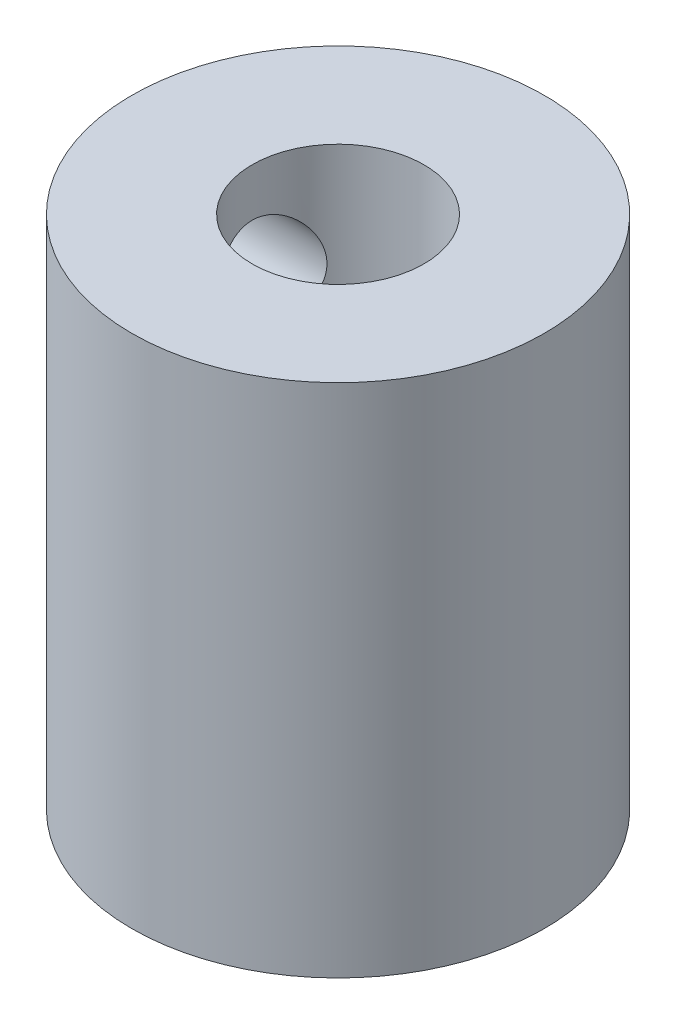
ISO-10303-21;
HEADER;
FILE_DESCRIPTION(('STEP AP214'),'2;1');
FILE_NAME('part.step','',(''),(''),'','','');
FILE_SCHEMA(('AUTOMOTIVE_DESIGN { 1 0 10303 214 1 1 1 1 }'));
ENDSEC;
DATA;
#1=APPLICATION_CONTEXT('core data for automotive mechanical design processes');
#2=APPLICATION_PROTOCOL_DEFINITION('international standard','automotive_design',2000,#1);
#3=PRODUCT_CONTEXT('',#1,'mechanical');
#4=PRODUCT('Part','Part','',(#3));
#5=PRODUCT_RELATED_PRODUCT_CATEGORY('part','',(#4));
#6=PRODUCT_DEFINITION_FORMATION('','',#4);
#7=PRODUCT_DEFINITION_CONTEXT('part definition',#1,'design');
#8=PRODUCT_DEFINITION('design','',#6,#7);
#9=PRODUCT_DEFINITION_SHAPE('','',#8);
#10=(LENGTH_UNIT() NAMED_UNIT(*) SI_UNIT(.MILLI.,.METRE.));
#11=(NAMED_UNIT(*) PLANE_ANGLE_UNIT() SI_UNIT($,.RADIAN.));
#12=(NAMED_UNIT(*) SI_UNIT($,.STERADIAN.) SOLID_ANGLE_UNIT());
#13=UNCERTAINTY_MEASURE_WITH_UNIT(LENGTH_MEASURE(1.E-05),#10,'distance_accuracy_value','');
#14=(GEOMETRIC_REPRESENTATION_CONTEXT(3) GLOBAL_UNCERTAINTY_ASSIGNED_CONTEXT((#13)) GLOBAL_UNIT_ASSIGNED_CONTEXT((#10,
#11,#12)) REPRESENTATION_CONTEXT('',''));
#15=CARTESIAN_POINT('',(0.,0.,0.));
#16=DIRECTION('',(0.,0.,1.));
#17=DIRECTION('',(1.,0.,0.));
#18=AXIS2_PLACEMENT_3D('',#15,#16,#17);
#19=CARTESIAN_POINT('',(0.,19.05,0.));
#20=DIRECTION('',(0.,1.,0.));
#21=DIRECTION('',(0.,0.,1.));
#22=AXIS2_PLACEMENT_3D('',#19,#20,#21);
#23=PLANE('',#22);
#24=CARTESIAN_POINT('',(0.,19.05,0.));
#25=DIRECTION('',(0.,1.,0.));
#26=DIRECTION('',(0.,0.,1.));
#27=AXIS2_PLACEMENT_3D('',#24,#25,#26);
#28=CIRCLE('',#27,7.62);
#29=CARTESIAN_POINT('',(0.,19.05,7.62));
#30=VERTEX_POINT('',#29);
#31=EDGE_CURVE('E10',#30,#30,#28,.T.);
#32=ORIENTED_EDGE('',*,*,#31,.T.);
#33=EDGE_LOOP('',(#32));
#34=FACE_BOUND('',#33,.T.);
#35=CARTESIAN_POINT('',(0.,19.05,0.));
#36=DIRECTION('',(0.,1.,0.));
#37=DIRECTION('',(0.,0.,1.));
#38=AXIS2_PLACEMENT_3D('',#35,#36,#37);
#39=CIRCLE('',#38,3.175);
#40=CARTESIAN_POINT('',(0.,19.05,3.175));
#41=VERTEX_POINT('',#40);
#42=EDGE_CURVE('E48',#41,#41,#39,.T.);
#43=ORIENTED_EDGE('',*,*,#42,.F.);
#44=EDGE_LOOP('',(#43));
#45=FACE_BOUND('',#44,.T.);
#46=ADVANCED_FACE('F30',(#34,#45),#23,.T.);
#47=CARTESIAN_POINT('',(0.,0.,0.));
#48=DIRECTION('',(0.,1.,0.));
#49=DIRECTION('',(0.,0.,1.));
#50=AXIS2_PLACEMENT_3D('',#47,#48,#49);
#51=PLANE('',#50);
#52=CARTESIAN_POINT('',(0.,0.,0.));
#53=DIRECTION('',(0.,1.,0.));
#54=DIRECTION('',(0.,0.,1.));
#55=AXIS2_PLACEMENT_3D('',#52,#53,#54);
#56=CIRCLE('',#55,7.62);
#57=CARTESIAN_POINT('',(0.,0.,7.62));
#58=VERTEX_POINT('',#57);
#59=EDGE_CURVE('E43',#58,#58,#56,.T.);
#60=ORIENTED_EDGE('',*,*,#59,.F.);
#61=EDGE_LOOP('',(#60));
#62=FACE_BOUND('',#61,.T.);
#63=CARTESIAN_POINT('',(0.,0.,0.));
#64=DIRECTION('',(0.,1.,0.));
#65=DIRECTION('',(0.,0.,1.));
#66=AXIS2_PLACEMENT_3D('',#63,#64,#65);
#67=CIRCLE('',#66,3.175);
#68=CARTESIAN_POINT('',(0.,0.,3.175));
#69=VERTEX_POINT('',#68);
#70=EDGE_CURVE('E51',#69,#69,#67,.T.);
#71=ORIENTED_EDGE('',*,*,#70,.T.);
#72=EDGE_LOOP('',(#71));
#73=FACE_BOUND('',#72,.T.);
#74=ADVANCED_FACE('F83',(#62,#73),#51,.F.);
#75=CARTESIAN_POINT('',(0.,19.05,0.));
#76=DIRECTION('',(0.,-1.,0.));
#77=DIRECTION('',(0.,0.,-1.));
#78=AXIS2_PLACEMENT_3D('',#75,#76,#77);
#79=CYLINDRICAL_SURFACE('',#78,7.62);
#80=CARTESIAN_POINT('',(-7.62,13.208,0.));
#81=CARTESIAN_POINT('',(-7.61999831151124,13.2080026588058,-0.11201862872618));
#82=CARTESIAN_POINT('',(-7.61750557940745,13.2172939760167,-0.22406575478539));
#83=CARTESIAN_POINT('',(-7.60780366799606,13.2541479704305,-0.444932258576134));
#84=CARTESIAN_POINT('',(-7.60059221897908,13.2817194404969,-0.553750056652191));
#85=CARTESIAN_POINT('',(-7.58224882584835,13.3541736135339,-0.764937854470037));
#86=CARTESIAN_POINT('',(-7.57112193804461,13.3990339970687,-0.867315970231529));
#87=CARTESIAN_POINT('',(-7.54612358338104,13.5047098385493,-1.06309534537494));
#88=CARTESIAN_POINT('',(-7.53225193363903,13.565526359733,-1.15649600597682));
#89=CARTESIAN_POINT('',(-7.50290208740426,13.702876852676,-1.33383477579986));
#90=CARTESIAN_POINT('',(-7.4873964316154,13.7797120066964,-1.41753507690059));
#91=CARTESIAN_POINT('',(-7.45670248234465,13.9462748587924,-1.57102773079208));
#92=CARTESIAN_POINT('',(-7.44151422994399,14.0360042140594,-1.64081829311595));
#93=CARTESIAN_POINT('',(-7.41289386063802,14.2277066065827,-1.7656699179131));
#94=CARTESIAN_POINT('',(-7.3994963878025,14.3298634695139,-1.82045739780271));
#95=CARTESIAN_POINT('',(-7.37637820955278,14.5423535528699,-1.91198548846226));
#96=CARTESIAN_POINT('',(-7.36665682625317,14.6526852613287,-1.94872942690591));
#97=CARTESIAN_POINT('',(-7.35227501655238,14.8757594664302,-2.00230150950128));
#98=CARTESIAN_POINT('',(-7.34750522176474,14.9883911965696,-2.01956080968607));
#99=CARTESIAN_POINT('',(-7.34323988211032,15.2150446862394,-2.03501787261113));
#100=CARTESIAN_POINT('',(-7.34374335174677,15.3290661820645,-2.03321919701046));
#101=CARTESIAN_POINT('',(-7.34986976862863,15.55189718202,-2.01095366162742));
#102=CARTESIAN_POINT('',(-7.35534963279716,15.6607633769511,-1.99100852561801));
#103=CARTESIAN_POINT('',(-7.37058229289979,15.8735454278075,-1.93385184701738));
#104=CARTESIAN_POINT('',(-7.38033543033454,15.9774608873566,-1.89663892444883));
#105=CARTESIAN_POINT('',(-7.4031415233636,16.1787516341095,-1.805577866767));
#106=CARTESIAN_POINT('',(-7.41623045903802,16.2760399287148,-1.75154682595989));
#107=CARTESIAN_POINT('',(-7.44421401316724,16.4603523053931,-1.62851087884958));
#108=CARTESIAN_POINT('',(-7.45910898680869,16.547374361783,-1.55950302499839));
#109=CARTESIAN_POINT('',(-7.48962190799941,16.7116648214141,-1.40580472979633));
#110=CARTESIAN_POINT('',(-7.50524759032652,16.788522499408,-1.32067617731952));
#111=CARTESIAN_POINT('',(-7.53502563376737,16.9269550008359,-1.13854755089767));
#112=CARTESIAN_POINT('',(-7.54917793680371,16.9885292219617,-1.04154700931237));
#113=CARTESIAN_POINT('',(-7.57450169524666,17.0948277892698,-0.837791827585411));
#114=CARTESIAN_POINT('',(-7.58565993998897,17.1394778067758,-0.730996660992618));
#115=CARTESIAN_POINT('',(-7.60364285111415,17.2100719438344,-0.511050331100642));
#116=CARTESIAN_POINT('',(-7.61046846441489,17.2360201509275,-0.397900562519177));
#117=CARTESIAN_POINT('',(-7.61887385095318,17.2678291949485,-0.171962148475844));
#118=CARTESIAN_POINT('',(-7.62059941430494,17.2742484484885,-0.0592574254436431));
#119=CARTESIAN_POINT('',(-7.61902943238762,17.2683595051251,0.165618206635617));
#120=CARTESIAN_POINT('',(-7.61573440609638,17.2560532438765,0.277789169655107));
#121=CARTESIAN_POINT('',(-7.60458764063957,17.2135206173807,0.496420089100207));
#122=CARTESIAN_POINT('',(-7.59681514971071,17.1836057178631,0.602945049660226));
#123=CARTESIAN_POINT('',(-7.57759515612445,17.1070666803799,0.809454282714881));
#124=CARTESIAN_POINT('',(-7.566147255241,17.0604407317294,0.909437845043482));
#125=CARTESIAN_POINT('',(-7.54050471128481,16.9507673306246,1.10219589026264));
#126=CARTESIAN_POINT('',(-7.52626065590636,16.8874160937335,1.19479079147656));
#127=CARTESIAN_POINT('',(-7.49667235603412,16.7464723437595,1.3682315895635));
#128=CARTESIAN_POINT('',(-7.4813278945916,16.6688770176773,1.44907516005997));
#129=CARTESIAN_POINT('',(-7.45073181800572,16.4990418532655,1.59907147270434));
#130=CARTESIAN_POINT('',(-7.43549502412181,16.4064507416225,1.66783023557813));
#131=CARTESIAN_POINT('',(-7.40731510337651,16.2107222687628,1.7888426624408));
#132=CARTESIAN_POINT('',(-7.39437188083617,16.1075853477597,1.84109701500115));
#133=CARTESIAN_POINT('',(-7.37239336667181,15.8942071680107,1.9272241017149));
#134=CARTESIAN_POINT('',(-7.36333552291097,15.7840112951933,1.96120321250021));
#135=CARTESIAN_POINT('',(-7.35014862328829,15.5591872512105,2.01006664400691));
#136=CARTESIAN_POINT('',(-7.34601830788334,15.4445602204465,2.02495584444118));
#137=CARTESIAN_POINT('',(-7.34325932486766,15.2181612955101,2.03493613488173));
#138=CARTESIAN_POINT('',(-7.34445468107131,15.1064190426176,2.03066046107998));
#139=CARTESIAN_POINT('',(-7.35180034418385,14.8853108297658,2.00390126016446));
#140=CARTESIAN_POINT('',(-7.3579505235863,14.7759448087314,1.98141820159586));
#141=CARTESIAN_POINT('',(-7.37440812210329,14.5634905558361,1.91924955950895));
#142=CARTESIAN_POINT('',(-7.38468307179958,14.4603603677841,1.87969815652789));
#143=CARTESIAN_POINT('',(-7.40823327226356,14.2621215081773,1.78461979435384));
#144=CARTESIAN_POINT('',(-7.42150899359306,14.1670140979187,1.7290903292101));
#145=CARTESIAN_POINT('',(-7.45005288183508,13.9844979547514,1.60171291817118));
#146=CARTESIAN_POINT('',(-7.46536818431318,13.8973981284642,1.52943285444196));
#147=CARTESIAN_POINT('',(-7.49600231843536,13.736358149106,1.37142782367277));
#148=CARTESIAN_POINT('',(-7.51132115003216,13.6624212007125,1.28569959202849));
#149=CARTESIAN_POINT('',(-7.54062817402432,13.5282510865508,1.1010188607861));
#150=CARTESIAN_POINT('',(-7.55458089095583,13.4683449091803,1.00182269713981));
#151=CARTESIAN_POINT('',(-7.57919551064544,13.3661531854158,0.794398858663558));
#152=CARTESIAN_POINT('',(-7.58985952366532,13.3238563335258,0.686177032211436));
#153=CARTESIAN_POINT('',(-7.60531628553683,13.2636003100178,0.481964700159086));
#154=CARTESIAN_POINT('',(-7.61078254922083,13.24279862627,0.386854208830076));
#155=CARTESIAN_POINT('',(-7.61812496221039,13.2149979985343,0.19450283204215));
#156=CARTESIAN_POINT('',(-7.62000146606026,13.2079976914448,0.0972621579313382));
#157=CARTESIAN_POINT('',(-7.62,13.208,0.));
#158=B_SPLINE_CURVE_WITH_KNOTS('',3,(#80,#81,#82,#83,#84,#85,#86,#87,#88,#89,#90,#91,#92,#93,
#94,#95,#96,#97,#98,#99,#100,#101,#102,#103,#104,#105,#106,#107,#108,#109,#110,#111,#112,#113,
#114,#115,#116,#117,#118,#119,#120,#121,#122,#123,#124,#125,#126,#127,#128,#129,#130,#131,#132,
#133,#134,#135,#136,#137,#138,#139,#140,#141,#142,#143,#144,#145,#146,#147,#148,#149,#150,#151,
#152,#153,#154,#155,#156,#157),.UNSPECIFIED.,.T.,.F.,(4,2,2,2,2,2,2,2,2,2,2,2,2,2,2,2,2,2,2,2,2,
2,2,2,2,2,2,2,2,2,2,2,2,2,2,2,2,2,4),(0.,0.335699200532762,0.671559991661632,1.00698864181948,
1.34243964896014,1.68488256322246,2.02736952843951,2.37573903843601,2.72404427635775,
3.06448112782475,3.40485435770789,3.73574058078732,4.06665325161947,4.40129852120042,
4.73600971127512,5.08163839969319,5.42728070688599,5.7744239055669,6.12149120825181,
6.45853641004939,6.79554677388156,7.12676792212389,7.45802496988024,7.79577090580623,
8.13358361351029,8.48092280324913,8.82824749992493,9.17352798462576,9.51872019202606,
9.85259235882069,10.1864559340892,10.5177413769548,10.8490788059697,11.1901664900453,
11.5313371032177,11.8798060831739,12.228050993635,12.5195565609723,12.8110333361384),.UNSPECIFIED.);
#159=CARTESIAN_POINT('',(-7.62,13.208,0.));
#160=VERTEX_POINT('',#159);
#161=EDGE_CURVE('E59',#160,#160,#158,.T.);
#162=ORIENTED_EDGE('',*,*,#161,.T.);
#163=EDGE_LOOP('',(#162));
#164=FACE_BOUND('',#163,.T.);
#165=CARTESIAN_POINT('',(-7.62,1.778,0.));
#166=CARTESIAN_POINT('',(-7.61999831151124,1.77800265880581,-0.11201862872618));
#167=CARTESIAN_POINT('',(-7.61750557940745,1.78729397601671,-0.22406575478539));
#168=CARTESIAN_POINT('',(-7.60780366799606,1.82414797043051,-0.444932258576135));
#169=CARTESIAN_POINT('',(-7.60059221897908,1.85171944049693,-0.553750056652192));
#170=CARTESIAN_POINT('',(-7.58224882584835,1.92417361353386,-0.764937854470037));
#171=CARTESIAN_POINT('',(-7.57112193804461,1.96903399706868,-0.867315970231529));
#172=CARTESIAN_POINT('',(-7.54612358338104,2.07470983854928,-1.06309534537494));
#173=CARTESIAN_POINT('',(-7.53225193363903,2.13552635973304,-1.15649600597682));
#174=CARTESIAN_POINT('',(-7.50290208740426,2.27287685267598,-1.33383477579986));
#175=CARTESIAN_POINT('',(-7.4873964316154,2.3497120066964,-1.41753507690059));
#176=CARTESIAN_POINT('',(-7.45670248234465,2.51627485879237,-1.57102773079208));
#177=CARTESIAN_POINT('',(-7.44151422994399,2.60600421405941,-1.64081829311595));
#178=CARTESIAN_POINT('',(-7.41289386063802,2.79770660658266,-1.7656699179131));
#179=CARTESIAN_POINT('',(-7.3994963878025,2.89986346951392,-1.82045739780271));
#180=CARTESIAN_POINT('',(-7.37637820955278,3.1123535528699,-1.91198548846226));
#181=CARTESIAN_POINT('',(-7.36665682625317,3.22268526132874,-1.94872942690591));
#182=CARTESIAN_POINT('',(-7.35227501655238,3.44575946643021,-2.00230150950128));
#183=CARTESIAN_POINT('',(-7.34750522176474,3.55839119656963,-2.01956080968607));
#184=CARTESIAN_POINT('',(-7.34323988211032,3.78504468623944,-2.03501787261113));
#185=CARTESIAN_POINT('',(-7.34374335174676,3.89906618206445,-2.03321919701046));
#186=CARTESIAN_POINT('',(-7.34986976862863,4.12189718202005,-2.01095366162742));
#187=CARTESIAN_POINT('',(-7.35534963279716,4.2307633769511,-1.99100852561801));
#188=CARTESIAN_POINT('',(-7.37058229289979,4.44354542780754,-1.93385184701738));
#189=CARTESIAN_POINT('',(-7.38033543033454,4.54746088735655,-1.89663892444883));
#190=CARTESIAN_POINT('',(-7.4031415233636,4.74875163410951,-1.805577866767));
#191=CARTESIAN_POINT('',(-7.41623045903802,4.84603992871484,-1.75154682595989));
#192=CARTESIAN_POINT('',(-7.44421401316724,5.03035230539315,-1.62851087884958));
#193=CARTESIAN_POINT('',(-7.45910898680869,5.11737436178297,-1.55950302499839));
#194=CARTESIAN_POINT('',(-7.48962190799941,5.28166482141408,-1.40580472979634));
#195=CARTESIAN_POINT('',(-7.50524759032652,5.35852249940799,-1.32067617731952));
#196=CARTESIAN_POINT('',(-7.53502563376737,5.49695500083589,-1.13854755089767));
#197=CARTESIAN_POINT('',(-7.54917793680371,5.55852922196167,-1.04154700931237));
#198=CARTESIAN_POINT('',(-7.57450169524666,5.66482778926984,-0.83779182758541));
#199=CARTESIAN_POINT('',(-7.58565993998897,5.70947780677577,-0.730996660992618));
#200=CARTESIAN_POINT('',(-7.60364285111415,5.78007194383439,-0.511050331100642));
#201=CARTESIAN_POINT('',(-7.61046846441489,5.80602015092754,-0.397900562519176));
#202=CARTESIAN_POINT('',(-7.61887385095318,5.83782919494851,-0.171962148475843));
#203=CARTESIAN_POINT('',(-7.62059941430494,5.84424844848848,-0.0592574254436418));
#204=CARTESIAN_POINT('',(-7.61902943238762,5.8383595051251,0.165618206635619));
#205=CARTESIAN_POINT('',(-7.61573440609638,5.82605324387654,0.277789169655108));
#206=CARTESIAN_POINT('',(-7.60458764063957,5.78352061738066,0.496420089100209));
#207=CARTESIAN_POINT('',(-7.59681514971071,5.75360571786307,0.602945049660228));
#208=CARTESIAN_POINT('',(-7.57759515612445,5.67706668037992,0.809454282714883));
#209=CARTESIAN_POINT('',(-7.566147255241,5.63044073172945,0.909437845043484));
#210=CARTESIAN_POINT('',(-7.54050471128481,5.52076733062458,1.10219589026264));
#211=CARTESIAN_POINT('',(-7.52626065590636,5.45741609373349,1.19479079147656));
#212=CARTESIAN_POINT('',(-7.49667235603412,5.31647234375948,1.3682315895635));
#213=CARTESIAN_POINT('',(-7.4813278945916,5.23887701767733,1.44907516005997));
#214=CARTESIAN_POINT('',(-7.45073181800572,5.06904185326553,1.59907147270434));
#215=CARTESIAN_POINT('',(-7.43549502412181,4.9764507416225,1.66783023557813));
#216=CARTESIAN_POINT('',(-7.40731510337651,4.78072226876278,1.7888426624408));
#217=CARTESIAN_POINT('',(-7.39437188083617,4.67758534775974,1.84109701500115));
#218=CARTESIAN_POINT('',(-7.37239336667181,4.46420716801068,1.9272241017149));
#219=CARTESIAN_POINT('',(-7.36333552291097,4.35401129519334,1.96120321250021));
#220=CARTESIAN_POINT('',(-7.35014862328829,4.12918725121045,2.01006664400691));
#221=CARTESIAN_POINT('',(-7.34601830788334,4.01456022044652,2.02495584444118));
#222=CARTESIAN_POINT('',(-7.34325932486766,3.78816129551006,2.03493613488173));
#223=CARTESIAN_POINT('',(-7.34445468107131,3.67641904261758,2.03066046107998));
#224=CARTESIAN_POINT('',(-7.35180034418385,3.45531082976581,2.00390126016446));
#225=CARTESIAN_POINT('',(-7.3579505235863,3.34594480873141,1.98141820159586));
#226=CARTESIAN_POINT('',(-7.37440812210329,3.13349055583608,1.91924955950894));
#227=CARTESIAN_POINT('',(-7.38468307179958,3.0303603677841,1.87969815652789));
#228=CARTESIAN_POINT('',(-7.40823327226356,2.83212150817731,1.78461979435384));
#229=CARTESIAN_POINT('',(-7.42150899359306,2.7370140979187,1.7290903292101));
#230=CARTESIAN_POINT('',(-7.45005288183508,2.55449795475144,1.60171291817118));
#231=CARTESIAN_POINT('',(-7.46536818431318,2.46739812846417,1.52943285444196));
#232=CARTESIAN_POINT('',(-7.49600231843536,2.306358149106,1.37142782367278));
#233=CARTESIAN_POINT('',(-7.51132115003216,2.23242120071245,1.28569959202849));
#234=CARTESIAN_POINT('',(-7.54062817402432,2.09825108655079,1.1010188607861));
#235=CARTESIAN_POINT('',(-7.55458089095583,2.03834490918028,1.00182269713981));
#236=CARTESIAN_POINT('',(-7.57919551064544,1.93615318541577,0.794398858663559));
#237=CARTESIAN_POINT('',(-7.58985952366532,1.89385633352578,0.686177032211437));
#238=CARTESIAN_POINT('',(-7.60531628553683,1.83360031001784,0.481964700159086));
#239=CARTESIAN_POINT('',(-7.61078254922083,1.81279862627002,0.386854208830076));
#240=CARTESIAN_POINT('',(-7.61812496221039,1.78499799853427,0.19450283204215));
#241=CARTESIAN_POINT('',(-7.62000146606026,1.77799769144478,0.0972621579313383));
#242=CARTESIAN_POINT('',(-7.62,1.778,0.));
#243=B_SPLINE_CURVE_WITH_KNOTS('',3,(#165,#166,#167,#168,#169,#170,#171,#172,#173,#174,#175,
#176,#177,#178,#179,#180,#181,#182,#183,#184,#185,#186,#187,#188,#189,#190,#191,#192,#193,#194,
#195,#196,#197,#198,#199,#200,#201,#202,#203,#204,#205,#206,#207,#208,#209,#210,#211,#212,#213,
#214,#215,#216,#217,#218,#219,#220,#221,#222,#223,#224,#225,#226,#227,#228,#229,#230,#231,#232,
#233,#234,#235,#236,#237,#238,#239,#240,#241,#242),.UNSPECIFIED.,.T.,.F.,(4,2,2,2,2,2,2,2,2,2,2,
2,2,2,2,2,2,2,2,2,2,2,2,2,2,2,2,2,2,2,2,2,2,2,2,2,2,2,4),(0.,0.335699200532762,
0.671559991661633,1.00698864181948,1.34243964896014,1.68488256322246,2.02736952843951,
2.37573903843601,2.72404427635775,3.06448112782475,3.40485435770789,3.73574058078733,
4.06665325161947,4.40129852120042,4.73600971127512,5.08163839969319,5.42728070688599,
5.7744239055669,6.12149120825181,6.4585364100494,6.79554677388156,7.1267679221239,
7.45802496988024,7.79577090580623,8.13358361351029,8.48092280324913,8.82824749992493,
9.17352798462577,9.51872019202607,9.85259235882069,10.1864559340892,10.5177413769548,
10.8490788059697,11.1901664900453,11.5313371032177,11.8798060831739,12.228050993635,
12.5195565609723,12.8110333361384),.UNSPECIFIED.);
#244=CARTESIAN_POINT('',(-7.62,1.778,0.));
#245=VERTEX_POINT('',#244);
#246=EDGE_CURVE('E58',#245,#245,#243,.T.);
#247=ORIENTED_EDGE('',*,*,#246,.T.);
#248=EDGE_LOOP('',(#247));
#249=FACE_BOUND('',#248,.T.);
#250=ORIENTED_EDGE('',*,*,#31,.F.);
#251=EDGE_LOOP('',(#250));
#252=FACE_BOUND('',#251,.T.);
#253=ORIENTED_EDGE('',*,*,#59,.T.);
#254=EDGE_LOOP('',(#253));
#255=FACE_BOUND('',#254,.T.);
#256=ADVANCED_FACE('F32',(#164,#249,#252,#255),#79,.T.);
#257=CARTESIAN_POINT('',(0.,19.05,0.));
#258=DIRECTION('',(0.,-1.,0.));
#259=DIRECTION('',(0.,0.,-1.));
#260=AXIS2_PLACEMENT_3D('',#257,#258,#259);
#261=CYLINDRICAL_SURFACE('',#260,3.175);
#262=CARTESIAN_POINT('',(-2.43959033446192,15.24,-2.032));
#263=CARTESIAN_POINT('',(-2.43960560687535,15.340395826837,-2.0319906906494));
#264=CARTESIAN_POINT('',(-2.44590181613486,15.4408746622441,-2.02449520417272));
#265=CARTESIAN_POINT('',(-2.46993660816849,15.6383445956715,-1.99508592642367));
#266=CARTESIAN_POINT('',(-2.48769727853939,15.7353285788289,-1.97314430137826));
#267=CARTESIAN_POINT('',(-2.53160890569595,15.9223941244383,-1.91646567701481));
#268=CARTESIAN_POINT('',(-2.55768544747968,16.0125284423073,-1.8818417721297));
#269=CARTESIAN_POINT('',(-2.61516202663432,16.185594660608,-1.80111207066332));
#270=CARTESIAN_POINT('',(-2.64656318171096,16.2685250433011,-1.7550038624223));
#271=CARTESIAN_POINT('',(-2.71649639761512,16.4377071038508,-1.64502031014287));
#272=CARTESIAN_POINT('',(-2.75540869613421,16.5227675615019,-1.57955393544279));
#273=CARTESIAN_POINT('',(-2.83290166546679,16.6817156321777,-1.43595387251811));
#274=CARTESIAN_POINT('',(-2.8714820155507,16.7555933822286,-1.35780912655708));
#275=CARTESIAN_POINT('',(-2.94983597723037,16.8995275455208,-1.17890004918128));
#276=CARTESIAN_POINT('',(-2.98912307518315,16.96786571149,-1.07651864172312));
#277=CARTESIAN_POINT('',(-3.05879981218692,17.0857832996314,-0.858714894448379));
#278=CARTESIAN_POINT('',(-3.08919860887737,17.1353820445857,-0.743306147922976));
#279=CARTESIAN_POINT('',(-3.13478263885192,17.2087543256668,-0.515551988416906));
#280=CARTESIAN_POINT('',(-3.15123393511991,17.2346992896143,-0.404166418731377));
#281=CARTESIAN_POINT('',(-3.17206464436738,17.2674519880389,-0.177551027060064));
#282=CARTESIAN_POINT('',(-3.17645760767123,17.2742812036484,-0.0623256675222542));
#283=CARTESIAN_POINT('',(-3.17294029193122,17.2687784089833,0.151175335224545));
#284=CARTESIAN_POINT('',(-3.16667207784306,17.2590040171741,0.249557588590133));
#285=CARTESIAN_POINT('',(-3.14545377030875,17.2255594700019,0.442950373129201));
#286=CARTESIAN_POINT('',(-3.13050302567325,17.2018882723777,0.537960650837486));
#287=CARTESIAN_POINT('',(-3.09318291665585,17.1417709655797,0.722290634776934));
#288=CARTESIAN_POINT('',(-3.07081067950887,17.1053199091741,0.811608121415795));
#289=CARTESIAN_POINT('',(-3.02034932845662,17.0210243205189,0.982902887916194));
#290=CARTESIAN_POINT('',(-2.9922590139071,16.9731773950803,1.06487862099062));
#291=CARTESIAN_POINT('',(-2.92842669968453,16.860648454199,1.23035387600054));
#292=CARTESIAN_POINT('',(-2.89216592444755,16.7945993733335,1.31272170831681));
#293=CARTESIAN_POINT('',(-2.81761610685472,16.6510720232513,1.4659271030076));
#294=CARTESIAN_POINT('',(-2.77932408218026,16.5735766330187,1.53674705266512));
#295=CARTESIAN_POINT('',(-2.69861309161834,16.3967053171572,1.67492058692648));
#296=CARTESIAN_POINT('',(-2.65636359903073,16.2957851361436,1.74041240699945));
#297=CARTESIAN_POINT('',(-2.57885863353487,16.0818839812472,1.85332494003863));
#298=CARTESIAN_POINT('',(-2.54359056646305,15.9689253013709,1.90077833850679));
#299=CARTESIAN_POINT('',(-2.49410883101592,15.7652609165589,1.96499965683747));
#300=CARTESIAN_POINT('',(-2.4767784689717,15.6768422900879,1.9866010794426));
#301=CARTESIAN_POINT('',(-2.45144094160757,15.4966580158802,2.01779068467212));
#302=CARTESIAN_POINT('',(-2.4434198357679,15.4048975855595,2.02739683174602));
#303=CARTESIAN_POINT('',(-2.4379214686582,15.2203228015895,2.03400774049162));
#304=CARTESIAN_POINT('',(-2.44047527217771,15.1275061427134,2.03097537517552));
#305=CARTESIAN_POINT('',(-2.45577902465709,14.9439572251862,2.012438262098));
#306=CARTESIAN_POINT('',(-2.46853750723237,14.8532267764731,1.99692307557127));
#307=CARTESIAN_POINT('',(-2.50191301920229,14.6786284968068,1.95492749292977));
#308=CARTESIAN_POINT('',(-2.52230754020317,14.5946412832127,1.92875588575241));
#309=CARTESIAN_POINT('',(-2.56870050515349,14.4321006838045,1.86652237764981));
#310=CARTESIAN_POINT('',(-2.59470080887705,14.3535491127709,1.83045719334797));
#311=CARTESIAN_POINT('',(-2.65548972917158,14.1878204123146,1.74138942095769));
#312=CARTESIAN_POINT('',(-2.69100340095279,14.1019482916214,1.68645540874418));
#313=CARTESIAN_POINT('',(-2.76354922078199,13.9396628329575,1.56475293882878));
#314=CARTESIAN_POINT('',(-2.80058313442028,13.8632609324924,1.49797040332464));
#315=CARTESIAN_POINT('',(-2.87982020860672,13.7080105722857,1.3402911969289));
#316=CARTESIAN_POINT('',(-2.92175004662432,13.6312090806837,1.24721771648232));
#317=CARTESIAN_POINT('',(-2.99926578938255,13.4943871648722,1.04713873893317));
#318=CARTESIAN_POINT('',(-3.03485862573718,13.4343483637297,0.940148688763854));
#319=CARTESIAN_POINT('',(-3.08964153296536,13.3438727530793,0.737211430728496));
#320=CARTESIAN_POINT('',(-3.11068836118579,13.3099173095332,0.643334050677406));
#321=CARTESIAN_POINT('',(-3.14444004495739,13.2559764873709,0.450223749684601));
#322=CARTESIAN_POINT('',(-3.15715160289693,13.2359798836183,0.350995201278174));
#323=CARTESIAN_POINT('',(-3.17308875610586,13.2109643255506,0.149561563495564));
#324=CARTESIAN_POINT('',(-3.17628327832487,13.2059944325489,0.047347821817472));
#325=CARTESIAN_POINT('',(-3.17277852126411,13.2114716617511,-0.15650030670876));
#326=CARTESIAN_POINT('',(-3.16607850875852,13.2219199265041,-0.258134650060809));
#327=CARTESIAN_POINT('',(-3.14403536370444,13.2566885570613,-0.452490442544355));
#328=CARTESIAN_POINT('',(-3.12915655006909,13.280264510948,-0.545401105681973));
#329=CARTESIAN_POINT('',(-3.09231981966813,13.3396364982491,-0.725713280896893));
#330=CARTESIAN_POINT('',(-3.07036075792634,13.3754345081979,-0.813113899187219));
#331=CARTESIAN_POINT('',(-3.01908095904135,13.4610914579743,-0.987231557473645));
#332=CARTESIAN_POINT('',(-2.98932872520794,13.51180978574,-1.07339581589463));
#333=CARTESIAN_POINT('',(-2.9256762203534,13.6244079986936,-1.23641294589243));
#334=CARTESIAN_POINT('',(-2.89177268114267,13.6862966963626,-1.3132583851016));
#335=CARTESIAN_POINT('',(-2.81685405217116,13.8302432313903,-1.46778942095363));
#336=CARTESIAN_POINT('',(-2.77554375341968,13.9139378922225,-1.54381018391407));
#337=CARTESIAN_POINT('',(-2.69447156224308,14.0932775331984,-1.68131499924998));
#338=CARTESIAN_POINT('',(-2.65471015932226,14.188926251684,-1.74279448672055));
#339=CARTESIAN_POINT('',(-2.58651832962349,14.3768512471508,-1.84218871294997));
#340=CARTESIAN_POINT('',(-2.55728086686841,14.4677221837625,-1.88219826807126));
#341=CARTESIAN_POINT('',(-2.50683404168969,14.6562335057551,-1.94889036181281));
#342=CARTESIAN_POINT('',(-2.48560392520877,14.7538556039597,-1.97560741120372));
#343=CARTESIAN_POINT('',(-2.46010574468423,14.9168593131256,-2.0071737387926));
#344=CARTESIAN_POINT('',(-2.45247057832203,14.9808810608854,-2.0164524486464));
#345=CARTESIAN_POINT('',(-2.44220786294128,15.1099235710405,-2.0288686715641));
#346=CARTESIAN_POINT('',(-2.43958043806791,15.1749443581625,-2.03200603238001));
#347=CARTESIAN_POINT('',(-2.43959033446192,15.24,-2.032));
#348=B_SPLINE_CURVE_WITH_KNOTS('',3,(#262,#263,#264,#265,#266,#267,#268,#269,#270,#271,#272,
#273,#274,#275,#276,#277,#278,#279,#280,#281,#282,#283,#284,#285,#286,#287,#288,#289,#290,#291,
#292,#293,#294,#295,#296,#297,#298,#299,#300,#301,#302,#303,#304,#305,#306,#307,#308,#309,#310,
#311,#312,#313,#314,#315,#316,#317,#318,#319,#320,#321,#322,#323,#324,#325,#326,#327,#328,#329,
#330,#331,#332,#333,#334,#335,#336,#337,#338,#339,#340,#341,#342,#343,#344,#345,#346,#347),
.UNSPECIFIED.,.T.,.F.,(4,2,2,2,2,2,2,2,2,2,2,2,2,2,2,2,2,2,2,2,2,2,2,2,2,2,2,2,2,2,2,2,2,2,2,2,
2,2,2,2,2,2,4),(0.,0.300893638355194,0.60236872002803,0.901218362306913,1.20013081485617,
1.5413502171271,1.88286883767622,2.26838205898625,2.65349667401251,2.99800890191599,
3.34213383189903,3.63790368768413,3.93369572905837,4.22960240162385,4.52557127093394,
4.85917453722895,5.19328194669334,5.57399780990564,5.95402049223352,6.23084443570467,
6.50725330097246,6.78447471840199,7.06192820363588,7.33185712401731,7.60187573417674,
7.92454882137253,8.24760789130984,8.62897114185201,9.00991464743881,9.31468391894021,
9.6192078240598,9.92472491370149,10.2302646445555,10.5200223322459,10.8098269013702,
11.1215735563981,11.4335672369134,11.7932202499333,12.1529860184796,12.4623420705608,
12.7708907079049,12.9658623927876,13.1608389110826),.UNSPECIFIED.);
#349=CARTESIAN_POINT('',(-2.43959033446192,15.24,-2.032));
#350=VERTEX_POINT('',#349);
#351=EDGE_CURVE('E35',#350,#350,#348,.T.);
#352=ORIENTED_EDGE('',*,*,#351,.F.);
#353=EDGE_LOOP('',(#352));
#354=FACE_BOUND('',#353,.T.);
#355=CARTESIAN_POINT('',(-2.43959033446192,3.81,-2.032));
#356=CARTESIAN_POINT('',(-2.43960560687535,3.91039582683698,-2.0319906906494));
#357=CARTESIAN_POINT('',(-2.44590181613486,4.01087466224405,-2.02449520417272));
#358=CARTESIAN_POINT('',(-2.46993660816849,4.20834459567152,-1.99508592642367));
#359=CARTESIAN_POINT('',(-2.48769727853939,4.30532857882888,-1.97314430137826));
#360=CARTESIAN_POINT('',(-2.53160890569595,4.49239412443834,-1.91646567701481));
#361=CARTESIAN_POINT('',(-2.55768544747968,4.58252844230727,-1.8818417721297));
#362=CARTESIAN_POINT('',(-2.61516202663432,4.75559466060797,-1.80111207066332));
#363=CARTESIAN_POINT('',(-2.64656318171096,4.83852504330109,-1.7550038624223));
#364=CARTESIAN_POINT('',(-2.71649639761512,5.00770710385082,-1.64502031014287));
#365=CARTESIAN_POINT('',(-2.75540869613421,5.09276756150187,-1.57955393544279));
#366=CARTESIAN_POINT('',(-2.83290166546679,5.25171563217775,-1.43595387251811));
#367=CARTESIAN_POINT('',(-2.8714820155507,5.32559338222856,-1.35780912655708));
#368=CARTESIAN_POINT('',(-2.94983597723037,5.46952754552075,-1.17890004918128));
#369=CARTESIAN_POINT('',(-2.98912307518315,5.53786571149004,-1.07651864172312));
#370=CARTESIAN_POINT('',(-3.05879981218692,5.65578329963144,-0.858714894448377));
#371=CARTESIAN_POINT('',(-3.08919860887737,5.70538204458568,-0.743306147922973));
#372=CARTESIAN_POINT('',(-3.13478263885192,5.77875432566677,-0.515551988416902));
#373=CARTESIAN_POINT('',(-3.15123393511992,5.80469928961429,-0.404166418731373));
#374=CARTESIAN_POINT('',(-3.17206464436738,5.83745198803886,-0.177551027060061));
#375=CARTESIAN_POINT('',(-3.17645760767123,5.84428120364839,-0.0623256675222511));
#376=CARTESIAN_POINT('',(-3.17294029193122,5.83877840898327,0.151175335224548));
#377=CARTESIAN_POINT('',(-3.16667207784306,5.82900401717405,0.249557588590135));
#378=CARTESIAN_POINT('',(-3.14545377030875,5.79555947000185,0.442950373129203));
#379=CARTESIAN_POINT('',(-3.13050302567325,5.77188827237771,0.537960650837489));
#380=CARTESIAN_POINT('',(-3.09318291665584,5.71177096557968,0.722290634776936));
#381=CARTESIAN_POINT('',(-3.07081067950886,5.67531990917412,0.811608121415796));
#382=CARTESIAN_POINT('',(-3.02034932845662,5.59102432051891,0.982902887916195));
#383=CARTESIAN_POINT('',(-2.9922590139071,5.54317739508031,1.06487862099062));
#384=CARTESIAN_POINT('',(-2.92842669968453,5.43064845419897,1.23035387600055));
#385=CARTESIAN_POINT('',(-2.89216592444755,5.36459937333353,1.31272170831681));
#386=CARTESIAN_POINT('',(-2.81761610685472,5.22107202325131,1.4659271030076));
#387=CARTESIAN_POINT('',(-2.77932408218025,5.14357663301865,1.53674705266512));
#388=CARTESIAN_POINT('',(-2.69861309161834,4.96670531715716,1.67492058692648));
#389=CARTESIAN_POINT('',(-2.65636359903073,4.8657851361436,1.74041240699945));
#390=CARTESIAN_POINT('',(-2.57885863353487,4.65188398124719,1.85332494003864));
#391=CARTESIAN_POINT('',(-2.54359056646305,4.53892530137093,1.90077833850679));
#392=CARTESIAN_POINT('',(-2.49410883101592,4.33526091655891,1.96499965683747));
#393=CARTESIAN_POINT('',(-2.47677846897169,4.24684229008787,1.9866010794426));
#394=CARTESIAN_POINT('',(-2.45144094160757,4.06665801588023,2.01779068467212));
#395=CARTESIAN_POINT('',(-2.4434198357679,3.97489758555949,2.02739683174602));
#396=CARTESIAN_POINT('',(-2.4379214686582,3.79032280158947,2.03400774049162));
#397=CARTESIAN_POINT('',(-2.44047527217771,3.69750614271338,2.03097537517552));
#398=CARTESIAN_POINT('',(-2.45577902465709,3.5139572251862,2.012438262098));
#399=CARTESIAN_POINT('',(-2.46853750723238,3.42322677647306,1.99692307557127));
#400=CARTESIAN_POINT('',(-2.50191301920229,3.2486284968068,1.95492749292977));
#401=CARTESIAN_POINT('',(-2.52230754020317,3.16464128321272,1.92875588575241));
#402=CARTESIAN_POINT('',(-2.56870050515349,3.00210068380451,1.86652237764981));
#403=CARTESIAN_POINT('',(-2.59470080887705,2.92354911277089,1.83045719334797));
#404=CARTESIAN_POINT('',(-2.65548972917158,2.75782041231459,1.74138942095769));
#405=CARTESIAN_POINT('',(-2.69100340095279,2.67194829162142,1.68645540874418));
#406=CARTESIAN_POINT('',(-2.76354922078199,2.50966283295752,1.56475293882878));
#407=CARTESIAN_POINT('',(-2.80058313442028,2.4332609324924,1.49797040332464));
#408=CARTESIAN_POINT('',(-2.87982020860672,2.27801057228571,1.3402911969289));
#409=CARTESIAN_POINT('',(-2.92175004662432,2.20120908068372,1.24721771648232));
#410=CARTESIAN_POINT('',(-2.99926578938255,2.06438716487222,1.04713873893316));
#411=CARTESIAN_POINT('',(-3.03485862573718,2.00434836372973,0.94014868876385));
#412=CARTESIAN_POINT('',(-3.08964153296536,1.91387275307925,0.737211430728491));
#413=CARTESIAN_POINT('',(-3.11068836118579,1.8799173095332,0.643334050677401));
#414=CARTESIAN_POINT('',(-3.14444004495739,1.82597648737094,0.450223749684596));
#415=CARTESIAN_POINT('',(-3.15715160289693,1.80597988361825,0.350995201278169));
#416=CARTESIAN_POINT('',(-3.17308875610586,1.78096432555057,0.149561563495558));
#417=CARTESIAN_POINT('',(-3.17628327832487,1.77599443254885,0.0473478218174663));
#418=CARTESIAN_POINT('',(-3.17277852126411,1.7814716617511,-0.156500306708766));
#419=CARTESIAN_POINT('',(-3.16607850875852,1.7919199265041,-0.258134650060814));
#420=CARTESIAN_POINT('',(-3.14403536370444,1.82668855706127,-0.45249044254436));
#421=CARTESIAN_POINT('',(-3.12915655006909,1.85026451094798,-0.545401105681979));
#422=CARTESIAN_POINT('',(-3.09231981966812,1.9096364982491,-0.725713280896899));
#423=CARTESIAN_POINT('',(-3.07036075792634,1.94543450819785,-0.813113899187225));
#424=CARTESIAN_POINT('',(-3.01908095904135,2.03109145797428,-0.98723155747365));
#425=CARTESIAN_POINT('',(-2.98932872520794,2.08180978574005,-1.07339581589464));
#426=CARTESIAN_POINT('',(-2.9256762203534,2.19440799869365,-1.23641294589244));
#427=CARTESIAN_POINT('',(-2.89177268114266,2.2562966963626,-1.31325838510161));
#428=CARTESIAN_POINT('',(-2.81685405217116,2.40024323139031,-1.46778942095363));
#429=CARTESIAN_POINT('',(-2.77554375341968,2.48393789222251,-1.54381018391407));
#430=CARTESIAN_POINT('',(-2.69447156224307,2.66327753319843,-1.68131499924999));
#431=CARTESIAN_POINT('',(-2.65471015932225,2.75892625168403,-1.74279448672056));
#432=CARTESIAN_POINT('',(-2.58651832962349,2.94685124715078,-1.84218871294997));
#433=CARTESIAN_POINT('',(-2.55728086686841,3.03772218376246,-1.88219826807126));
#434=CARTESIAN_POINT('',(-2.50683404168969,3.22623350575513,-1.94889036181281));
#435=CARTESIAN_POINT('',(-2.48560392520877,3.32385560395967,-1.97560741120372));
#436=CARTESIAN_POINT('',(-2.46010574468423,3.48685931312563,-2.0071737387926));
#437=CARTESIAN_POINT('',(-2.45247057832203,3.55088106088535,-2.0164524486464));
#438=CARTESIAN_POINT('',(-2.44220786294128,3.67992357104049,-2.0288686715641));
#439=CARTESIAN_POINT('',(-2.43958043806791,3.74494435816246,-2.03200603238001));
#440=CARTESIAN_POINT('',(-2.43959033446192,3.81,-2.032));
#441=B_SPLINE_CURVE_WITH_KNOTS('',3,(#355,#356,#357,#358,#359,#360,#361,#362,#363,#364,#365,
#366,#367,#368,#369,#370,#371,#372,#373,#374,#375,#376,#377,#378,#379,#380,#381,#382,#383,#384,
#385,#386,#387,#388,#389,#390,#391,#392,#393,#394,#395,#396,#397,#398,#399,#400,#401,#402,#403,
#404,#405,#406,#407,#408,#409,#410,#411,#412,#413,#414,#415,#416,#417,#418,#419,#420,#421,#422,
#423,#424,#425,#426,#427,#428,#429,#430,#431,#432,#433,#434,#435,#436,#437,#438,#439,#440),
.UNSPECIFIED.,.T.,.F.,(4,2,2,2,2,2,2,2,2,2,2,2,2,2,2,2,2,2,2,2,2,2,2,2,2,2,2,2,2,2,2,2,2,2,2,2,
2,2,2,2,2,2,4),(0.,0.300893638355196,0.602368720028032,0.901218362306917,1.20013081485617,
1.54135021712711,1.88286883767623,2.26838205898626,2.65349667401252,2.99800890191599,
3.34213383189903,3.63790368768414,3.93369572905838,4.22960240162385,4.52557127093394,
4.85917453722895,5.19328194669334,5.57399780990564,5.95402049223352,6.23084443570467,
6.50725330097247,6.78447471840199,7.06192820363589,7.33185712401732,7.60187573417675,
7.92454882137253,8.24760789130984,8.62897114185202,9.00991464743882,9.31468391894022,
9.61920782405981,9.9247249137015,10.2302646445555,10.5200223322459,10.8098269013703,
11.1215735563981,11.4335672369135,11.7932202499333,12.1529860184796,12.4623420705608,
12.7708907079049,12.9658623927876,13.1608389110826),.UNSPECIFIED.);
#442=CARTESIAN_POINT('',(-2.43959033446192,3.81,-2.032));
#443=VERTEX_POINT('',#442);
#444=EDGE_CURVE('E53',#443,#443,#441,.T.);
#445=ORIENTED_EDGE('',*,*,#444,.F.);
#446=EDGE_LOOP('',(#445));
#447=FACE_BOUND('',#446,.T.);
#448=ORIENTED_EDGE('',*,*,#42,.T.);
#449=EDGE_LOOP('',(#448));
#450=FACE_BOUND('',#449,.T.);
#451=ORIENTED_EDGE('',*,*,#70,.F.);
#452=EDGE_LOOP('',(#451));
#453=FACE_BOUND('',#452,.T.);
#454=ADVANCED_FACE('F60',(#354,#447,#450,#453),#261,.F.);
#455=CARTESIAN_POINT('',(-7.62,3.81,0.));
#456=DIRECTION('',(1.,0.,0.));
#457=DIRECTION('',(0.,0.,-1.));
#458=AXIS2_PLACEMENT_3D('',#455,#456,#457);
#459=CYLINDRICAL_SURFACE('',#458,2.032);
#460=ORIENTED_EDGE('',*,*,#444,.T.);
#461=EDGE_LOOP('',(#460));
#462=FACE_BOUND('',#461,.T.);
#463=ORIENTED_EDGE('',*,*,#246,.F.);
#464=EDGE_LOOP('',(#463));
#465=FACE_BOUND('',#464,.T.);
#466=ADVANCED_FACE('F63',(#462,#465),#459,.F.);
#467=CARTESIAN_POINT('',(-7.62,15.24,0.));
#468=DIRECTION('',(1.,0.,0.));
#469=DIRECTION('',(0.,0.,-1.));
#470=AXIS2_PLACEMENT_3D('',#467,#468,#469);
#471=CYLINDRICAL_SURFACE('',#470,2.032);
#472=ORIENTED_EDGE('',*,*,#351,.T.);
#473=EDGE_LOOP('',(#472));
#474=FACE_BOUND('',#473,.T.);
#475=ORIENTED_EDGE('',*,*,#161,.F.);
#476=EDGE_LOOP('',(#475));
#477=FACE_BOUND('',#476,.T.);
#478=ADVANCED_FACE('F66',(#474,#477),#471,.F.);
#479=CLOSED_SHELL('',(#46,#74,#256,#454,#466,#478));
#480=MANIFOLD_SOLID_BREP('B2',#479);
#481=ADVANCED_BREP_SHAPE_REPRESENTATION('',(#18,#480),#14);
#482=SHAPE_DEFINITION_REPRESENTATION(#9,#481);
ENDSEC;
END-ISO-10303-21;
